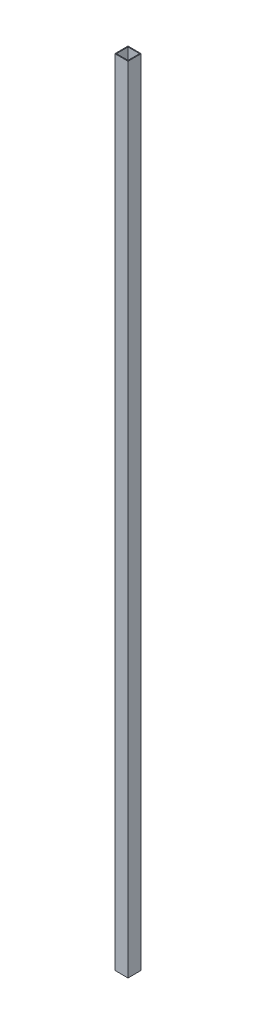
ISO-10303-21;
HEADER;
FILE_DESCRIPTION(('STEP AP214'),'2;1');
FILE_NAME('part.step','',(''),(''),'','','');
FILE_SCHEMA(('AUTOMOTIVE_DESIGN { 1 0 10303 214 1 1 1 1 }'));
ENDSEC;
DATA;
#1=APPLICATION_CONTEXT('core data for automotive mechanical design processes');
#2=APPLICATION_PROTOCOL_DEFINITION('international standard','automotive_design',2000,#1);
#3=PRODUCT_CONTEXT('',#1,'mechanical');
#4=PRODUCT('Part','Part','',(#3));
#5=PRODUCT_RELATED_PRODUCT_CATEGORY('part','',(#4));
#6=PRODUCT_DEFINITION_FORMATION('','',#4);
#7=PRODUCT_DEFINITION_CONTEXT('part definition',#1,'design');
#8=PRODUCT_DEFINITION('design','',#6,#7);
#9=PRODUCT_DEFINITION_SHAPE('','',#8);
#10=(LENGTH_UNIT() NAMED_UNIT(*) SI_UNIT(.MILLI.,.METRE.));
#11=(NAMED_UNIT(*) PLANE_ANGLE_UNIT() SI_UNIT($,.RADIAN.));
#12=(NAMED_UNIT(*) SI_UNIT($,.STERADIAN.) SOLID_ANGLE_UNIT());
#13=UNCERTAINTY_MEASURE_WITH_UNIT(LENGTH_MEASURE(1.E-05),#10,'distance_accuracy_value','');
#14=(GEOMETRIC_REPRESENTATION_CONTEXT(3) GLOBAL_UNCERTAINTY_ASSIGNED_CONTEXT((#13)) GLOBAL_UNIT_ASSIGNED_CONTEXT((#10,
#11,#12)) REPRESENTATION_CONTEXT('',''));
#15=CARTESIAN_POINT('',(0.,0.,0.));
#16=DIRECTION('',(0.,0.,1.));
#17=DIRECTION('',(1.,0.,0.));
#18=AXIS2_PLACEMENT_3D('',#15,#16,#17);
#19=CARTESIAN_POINT('',(0.,3048.,0.));
#20=DIRECTION('',(0.,1.,0.));
#21=DIRECTION('',(0.,0.,1.));
#22=AXIS2_PLACEMENT_3D('',#19,#20,#21);
#23=PLANE('',#22);
#24=DIRECTION('',(0.,0.,-1.));
#25=VECTOR('',#24,1.);
#26=CARTESIAN_POINT('',(25.4,3048.,-25.4));
#27=LINE('',#26,#25);
#28=CARTESIAN_POINT('',(25.4,3048.,25.4));
#29=VERTEX_POINT('',#28);
#30=CARTESIAN_POINT('',(25.4,3048.,-25.4));
#31=VERTEX_POINT('',#30);
#32=EDGE_CURVE('E153',#29,#31,#27,.T.);
#33=ORIENTED_EDGE('',*,*,#32,.T.);
#34=DIRECTION('',(-1.,0.,0.));
#35=VECTOR('',#34,1.);
#36=CARTESIAN_POINT('',(-25.4,3048.,-25.4));
#37=LINE('',#36,#35);
#38=CARTESIAN_POINT('',(-25.4,3048.,-25.4));
#39=VERTEX_POINT('',#38);
#40=EDGE_CURVE('E157',#31,#39,#37,.T.);
#41=ORIENTED_EDGE('',*,*,#40,.T.);
#42=DIRECTION('',(0.,0.,1.));
#43=VECTOR('',#42,1.);
#44=CARTESIAN_POINT('',(-25.4,3048.,-25.4));
#45=LINE('',#44,#43);
#46=CARTESIAN_POINT('',(-25.4,3048.,25.4));
#47=VERTEX_POINT('',#46);
#48=EDGE_CURVE('E161',#39,#47,#45,.T.);
#49=ORIENTED_EDGE('',*,*,#48,.T.);
#50=DIRECTION('',(1.,0.,0.));
#51=VECTOR('',#50,1.);
#52=CARTESIAN_POINT('',(-25.4,3048.,25.4));
#53=LINE('',#52,#51);
#54=EDGE_CURVE('E164',#47,#29,#53,.T.);
#55=ORIENTED_EDGE('',*,*,#54,.T.);
#56=EDGE_LOOP('',(#33,#41,#49,#55));
#57=FACE_BOUND('',#56,.T.);
#58=DIRECTION('',(-1.,0.,0.));
#59=VECTOR('',#58,1.);
#60=CARTESIAN_POINT('',(-22.225,3048.,-22.225));
#61=LINE('',#60,#59);
#62=CARTESIAN_POINT('',(22.225,3048.,-22.225));
#63=VERTEX_POINT('',#62);
#64=CARTESIAN_POINT('',(-22.225,3048.,-22.225));
#65=VERTEX_POINT('',#64);
#66=EDGE_CURVE('E114',#63,#65,#61,.T.);
#67=ORIENTED_EDGE('',*,*,#66,.F.);
#68=DIRECTION('',(0.,0.,-1.));
#69=VECTOR('',#68,1.);
#70=CARTESIAN_POINT('',(22.225,3048.,-22.225));
#71=LINE('',#70,#69);
#72=CARTESIAN_POINT('',(22.225,3048.,22.225));
#73=VERTEX_POINT('',#72);
#74=EDGE_CURVE('E105',#73,#63,#71,.T.);
#75=ORIENTED_EDGE('',*,*,#74,.F.);
#76=DIRECTION('',(1.,0.,0.));
#77=VECTOR('',#76,1.);
#78=CARTESIAN_POINT('',(-22.225,3048.,22.225));
#79=LINE('',#78,#77);
#80=CARTESIAN_POINT('',(-22.225,3048.,22.225));
#81=VERTEX_POINT('',#80);
#82=EDGE_CURVE('E131',#81,#73,#79,.T.);
#83=ORIENTED_EDGE('',*,*,#82,.F.);
#84=DIRECTION('',(0.,0.,1.));
#85=VECTOR('',#84,1.);
#86=CARTESIAN_POINT('',(-22.225,3048.,-22.225));
#87=LINE('',#86,#85);
#88=EDGE_CURVE('E127',#65,#81,#87,.T.);
#89=ORIENTED_EDGE('',*,*,#88,.F.);
#90=EDGE_LOOP('',(#67,#75,#83,#89));
#91=FACE_BOUND('',#90,.T.);
#92=ADVANCED_FACE('F39',(#57,#91),#23,.T.);
#93=CARTESIAN_POINT('',(0.,0.,0.));
#94=DIRECTION('',(0.,1.,0.));
#95=DIRECTION('',(0.,0.,1.));
#96=AXIS2_PLACEMENT_3D('',#93,#94,#95);
#97=PLANE('',#96);
#98=DIRECTION('',(0.,0.,-1.));
#99=VECTOR('',#98,1.);
#100=CARTESIAN_POINT('',(25.4,0.,-25.4));
#101=LINE('',#100,#99);
#102=CARTESIAN_POINT('',(25.4,0.,25.4));
#103=VERTEX_POINT('',#102);
#104=CARTESIAN_POINT('',(25.4,0.,-25.4));
#105=VERTEX_POINT('',#104);
#106=EDGE_CURVE('E123',#103,#105,#101,.T.);
#107=ORIENTED_EDGE('',*,*,#106,.F.);
#108=DIRECTION('',(1.,0.,0.));
#109=VECTOR('',#108,1.);
#110=CARTESIAN_POINT('',(-25.4,0.,25.4));
#111=LINE('',#110,#109);
#112=CARTESIAN_POINT('',(-25.4,0.,25.4));
#113=VERTEX_POINT('',#112);
#114=EDGE_CURVE('E158',#113,#103,#111,.T.);
#115=ORIENTED_EDGE('',*,*,#114,.F.);
#116=DIRECTION('',(0.,0.,1.));
#117=VECTOR('',#116,1.);
#118=CARTESIAN_POINT('',(-25.4,0.,-25.4));
#119=LINE('',#118,#117);
#120=CARTESIAN_POINT('',(-25.4,0.,-25.4));
#121=VERTEX_POINT('',#120);
#122=EDGE_CURVE('E174',#121,#113,#119,.T.);
#123=ORIENTED_EDGE('',*,*,#122,.F.);
#124=DIRECTION('',(-1.,0.,0.));
#125=VECTOR('',#124,1.);
#126=CARTESIAN_POINT('',(-25.4,0.,-25.4));
#127=LINE('',#126,#125);
#128=EDGE_CURVE('E171',#105,#121,#127,.T.);
#129=ORIENTED_EDGE('',*,*,#128,.F.);
#130=EDGE_LOOP('',(#107,#115,#123,#129));
#131=FACE_BOUND('',#130,.T.);
#132=DIRECTION('',(0.,0.,-1.));
#133=VECTOR('',#132,1.);
#134=CARTESIAN_POINT('',(22.225,0.,-22.225));
#135=LINE('',#134,#133);
#136=CARTESIAN_POINT('',(22.225,0.,22.225));
#137=VERTEX_POINT('',#136);
#138=CARTESIAN_POINT('',(22.225,0.,-22.225));
#139=VERTEX_POINT('',#138);
#140=EDGE_CURVE('E63',#137,#139,#135,.T.);
#141=ORIENTED_EDGE('',*,*,#140,.T.);
#142=DIRECTION('',(-1.,0.,0.));
#143=VECTOR('',#142,1.);
#144=CARTESIAN_POINT('',(-22.225,0.,-22.225));
#145=LINE('',#144,#143);
#146=CARTESIAN_POINT('',(-22.225,0.,-22.225));
#147=VERTEX_POINT('',#146);
#148=EDGE_CURVE('E121',#139,#147,#145,.T.);
#149=ORIENTED_EDGE('',*,*,#148,.T.);
#150=DIRECTION('',(0.,0.,1.));
#151=VECTOR('',#150,1.);
#152=CARTESIAN_POINT('',(-22.225,0.,-22.225));
#153=LINE('',#152,#151);
#154=CARTESIAN_POINT('',(-22.225,0.,22.225));
#155=VERTEX_POINT('',#154);
#156=EDGE_CURVE('E140',#147,#155,#153,.T.);
#157=ORIENTED_EDGE('',*,*,#156,.T.);
#158=DIRECTION('',(1.,0.,0.));
#159=VECTOR('',#158,1.);
#160=CARTESIAN_POINT('',(-22.225,0.,22.225));
#161=LINE('',#160,#159);
#162=EDGE_CURVE('E115',#155,#137,#161,.T.);
#163=ORIENTED_EDGE('',*,*,#162,.T.);
#164=EDGE_LOOP('',(#141,#149,#157,#163));
#165=FACE_BOUND('',#164,.T.);
#166=ADVANCED_FACE('F197',(#131,#165),#97,.F.);
#167=CARTESIAN_POINT('',(25.4,3048.,-25.4));
#168=DIRECTION('',(-1.,0.,0.));
#169=DIRECTION('',(0.,0.,1.));
#170=AXIS2_PLACEMENT_3D('',#167,#168,#169);
#171=PLANE('',#170);
#172=ORIENTED_EDGE('',*,*,#106,.T.);
#173=DIRECTION('',(0.,-1.,0.));
#174=VECTOR('',#173,1.);
#175=CARTESIAN_POINT('',(25.4,3048.,-25.4));
#176=LINE('',#175,#174);
#177=EDGE_CURVE('E11',#31,#105,#176,.T.);
#178=ORIENTED_EDGE('',*,*,#177,.F.);
#179=ORIENTED_EDGE('',*,*,#32,.F.);
#180=DIRECTION('',(0.,-1.,0.));
#181=VECTOR('',#180,1.);
#182=CARTESIAN_POINT('',(25.4,3048.,25.4));
#183=LINE('',#182,#181);
#184=EDGE_CURVE('E167',#29,#103,#183,.T.);
#185=ORIENTED_EDGE('',*,*,#184,.T.);
#186=EDGE_LOOP('',(#172,#178,#179,#185));
#187=FACE_BOUND('',#186,.T.);
#188=ADVANCED_FACE('F41',(#187),#171,.F.);
#189=CARTESIAN_POINT('',(-25.4,3048.,-25.4));
#190=DIRECTION('',(0.,0.,1.));
#191=DIRECTION('',(1.,0.,0.));
#192=AXIS2_PLACEMENT_3D('',#189,#190,#191);
#193=PLANE('',#192);
#194=ORIENTED_EDGE('',*,*,#128,.T.);
#195=DIRECTION('',(0.,-1.,0.));
#196=VECTOR('',#195,1.);
#197=CARTESIAN_POINT('',(-25.4,3048.,-25.4));
#198=LINE('',#197,#196);
#199=EDGE_CURVE('E48',#39,#121,#198,.T.);
#200=ORIENTED_EDGE('',*,*,#199,.F.);
#201=ORIENTED_EDGE('',*,*,#40,.F.);
#202=ORIENTED_EDGE('',*,*,#177,.T.);
#203=EDGE_LOOP('',(#194,#200,#201,#202));
#204=FACE_BOUND('',#203,.T.);
#205=ADVANCED_FACE('F207',(#204),#193,.F.);
#206=CARTESIAN_POINT('',(-25.4,3048.,-25.4));
#207=DIRECTION('',(1.,0.,0.));
#208=DIRECTION('',(0.,0.,-1.));
#209=AXIS2_PLACEMENT_3D('',#206,#207,#208);
#210=PLANE('',#209);
#211=ORIENTED_EDGE('',*,*,#122,.T.);
#212=DIRECTION('',(0.,-1.,0.));
#213=VECTOR('',#212,1.);
#214=CARTESIAN_POINT('',(-25.4,3048.,25.4));
#215=LINE('',#214,#213);
#216=EDGE_CURVE('E182',#47,#113,#215,.T.);
#217=ORIENTED_EDGE('',*,*,#216,.F.);
#218=ORIENTED_EDGE('',*,*,#48,.F.);
#219=ORIENTED_EDGE('',*,*,#199,.T.);
#220=EDGE_LOOP('',(#211,#217,#218,#219));
#221=FACE_BOUND('',#220,.T.);
#222=ADVANCED_FACE('F191',(#221),#210,.F.);
#223=CARTESIAN_POINT('',(-25.4,3048.,25.4));
#224=DIRECTION('',(0.,0.,-1.));
#225=DIRECTION('',(-1.,0.,0.));
#226=AXIS2_PLACEMENT_3D('',#223,#224,#225);
#227=PLANE('',#226);
#228=ORIENTED_EDGE('',*,*,#114,.T.);
#229=ORIENTED_EDGE('',*,*,#184,.F.);
#230=ORIENTED_EDGE('',*,*,#54,.F.);
#231=ORIENTED_EDGE('',*,*,#216,.T.);
#232=EDGE_LOOP('',(#228,#229,#230,#231));
#233=FACE_BOUND('',#232,.T.);
#234=ADVANCED_FACE('F201',(#233),#227,.F.);
#235=CARTESIAN_POINT('',(22.225,3048.,-22.225));
#236=DIRECTION('',(-1.,0.,0.));
#237=DIRECTION('',(0.,0.,1.));
#238=AXIS2_PLACEMENT_3D('',#235,#236,#237);
#239=PLANE('',#238);
#240=ORIENTED_EDGE('',*,*,#140,.F.);
#241=DIRECTION('',(0.,-1.,0.));
#242=VECTOR('',#241,1.);
#243=CARTESIAN_POINT('',(22.225,3048.,22.225));
#244=LINE('',#243,#242);
#245=EDGE_CURVE('E109',#73,#137,#244,.T.);
#246=ORIENTED_EDGE('',*,*,#245,.F.);
#247=ORIENTED_EDGE('',*,*,#74,.T.);
#248=DIRECTION('',(0.,-1.,0.));
#249=VECTOR('',#248,1.);
#250=CARTESIAN_POINT('',(22.225,3048.,-22.225));
#251=LINE('',#250,#249);
#252=EDGE_CURVE('E108',#63,#139,#251,.T.);
#253=ORIENTED_EDGE('',*,*,#252,.T.);
#254=EDGE_LOOP('',(#240,#246,#247,#253));
#255=FACE_BOUND('',#254,.T.);
#256=ADVANCED_FACE('F107',(#255),#239,.T.);
#257=CARTESIAN_POINT('',(-22.225,3048.,-22.225));
#258=DIRECTION('',(0.,0.,1.));
#259=DIRECTION('',(1.,0.,0.));
#260=AXIS2_PLACEMENT_3D('',#257,#258,#259);
#261=PLANE('',#260);
#262=ORIENTED_EDGE('',*,*,#148,.F.);
#263=ORIENTED_EDGE('',*,*,#252,.F.);
#264=ORIENTED_EDGE('',*,*,#66,.T.);
#265=DIRECTION('',(0.,-1.,0.));
#266=VECTOR('',#265,1.);
#267=CARTESIAN_POINT('',(-22.225,3048.,-22.225));
#268=LINE('',#267,#266);
#269=EDGE_CURVE('E124',#65,#147,#268,.T.);
#270=ORIENTED_EDGE('',*,*,#269,.T.);
#271=EDGE_LOOP('',(#262,#263,#264,#270));
#272=FACE_BOUND('',#271,.T.);
#273=ADVANCED_FACE('F118',(#272),#261,.T.);
#274=CARTESIAN_POINT('',(-22.225,3048.,-22.225));
#275=DIRECTION('',(1.,0.,0.));
#276=DIRECTION('',(0.,0.,-1.));
#277=AXIS2_PLACEMENT_3D('',#274,#275,#276);
#278=PLANE('',#277);
#279=ORIENTED_EDGE('',*,*,#156,.F.);
#280=ORIENTED_EDGE('',*,*,#269,.F.);
#281=ORIENTED_EDGE('',*,*,#88,.T.);
#282=DIRECTION('',(0.,-1.,0.));
#283=VECTOR('',#282,1.);
#284=CARTESIAN_POINT('',(-22.225,3048.,22.225));
#285=LINE('',#284,#283);
#286=EDGE_CURVE('E55',#81,#155,#285,.T.);
#287=ORIENTED_EDGE('',*,*,#286,.T.);
#288=EDGE_LOOP('',(#279,#280,#281,#287));
#289=FACE_BOUND('',#288,.T.);
#290=ADVANCED_FACE('F230',(#289),#278,.T.);
#291=CARTESIAN_POINT('',(-22.225,3048.,22.225));
#292=DIRECTION('',(0.,0.,-1.));
#293=DIRECTION('',(-1.,0.,0.));
#294=AXIS2_PLACEMENT_3D('',#291,#292,#293);
#295=PLANE('',#294);
#296=ORIENTED_EDGE('',*,*,#162,.F.);
#297=ORIENTED_EDGE('',*,*,#286,.F.);
#298=ORIENTED_EDGE('',*,*,#82,.T.);
#299=ORIENTED_EDGE('',*,*,#245,.T.);
#300=EDGE_LOOP('',(#296,#297,#298,#299));
#301=FACE_BOUND('',#300,.T.);
#302=ADVANCED_FACE('F234',(#301),#295,.T.);
#303=CLOSED_SHELL('',(#92,#166,#188,#205,#222,#234,#256,#273,#290,#302));
#304=MANIFOLD_SOLID_BREP('B2',#303);
#305=ADVANCED_BREP_SHAPE_REPRESENTATION('',(#18,#304),#14);
#306=SHAPE_DEFINITION_REPRESENTATION(#9,#305);
ENDSEC;
END-ISO-10303-21;
